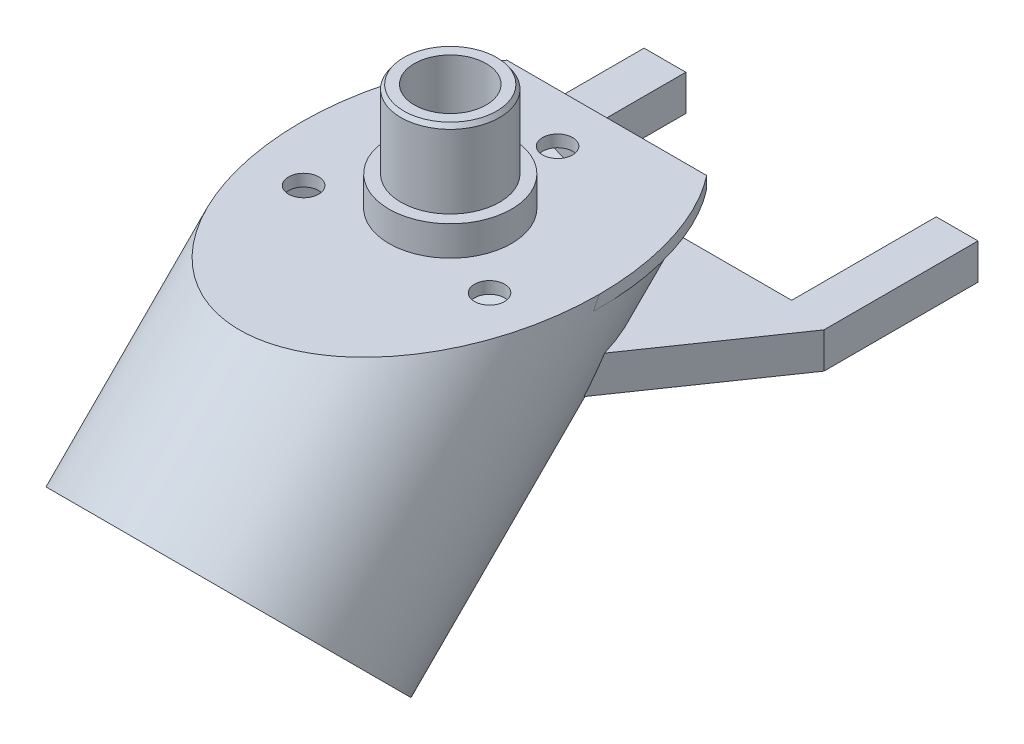
ISO-10303-21;
HEADER;
FILE_DESCRIPTION(('STEP AP214'),'2;1');
FILE_NAME('part.step','',(''),(''),'','','');
FILE_SCHEMA(('AUTOMOTIVE_DESIGN { 1 0 10303 214 1 1 1 1 }'));
ENDSEC;
DATA;
#1=APPLICATION_CONTEXT('core data for automotive mechanical design processes');
#2=APPLICATION_PROTOCOL_DEFINITION('international standard','automotive_design',2000,#1);
#3=PRODUCT_CONTEXT('',#1,'mechanical');
#4=PRODUCT('Part','Part','',(#3));
#5=PRODUCT_RELATED_PRODUCT_CATEGORY('part','',(#4));
#6=PRODUCT_DEFINITION_FORMATION('','',#4);
#7=PRODUCT_DEFINITION_CONTEXT('part definition',#1,'design');
#8=PRODUCT_DEFINITION('design','',#6,#7);
#9=PRODUCT_DEFINITION_SHAPE('','',#8);
#10=(LENGTH_UNIT() NAMED_UNIT(*) SI_UNIT(.MILLI.,.METRE.));
#11=(NAMED_UNIT(*) PLANE_ANGLE_UNIT() SI_UNIT($,.RADIAN.));
#12=(NAMED_UNIT(*) SI_UNIT($,.STERADIAN.) SOLID_ANGLE_UNIT());
#13=UNCERTAINTY_MEASURE_WITH_UNIT(LENGTH_MEASURE(1.E-05),#10,'distance_accuracy_value','');
#14=(GEOMETRIC_REPRESENTATION_CONTEXT(3) GLOBAL_UNCERTAINTY_ASSIGNED_CONTEXT((#13)) GLOBAL_UNIT_ASSIGNED_CONTEXT((#10,
#11,#12)) REPRESENTATION_CONTEXT('',''));
#15=CARTESIAN_POINT('',(0.,0.,0.));
#16=DIRECTION('',(0.,0.,1.));
#17=DIRECTION('',(1.,0.,0.));
#18=AXIS2_PLACEMENT_3D('',#15,#16,#17);
#19=CARTESIAN_POINT('',(0.,-54.8629664321684,54.8629664321686));
#20=DIRECTION('',(0.,0.707106781186546,-0.707106781186549));
#21=DIRECTION('',(0.,0.707106781186549,0.707106781186546));
#22=AXIS2_PLACEMENT_3D('',#19,#20,#21);
#23=CYLINDRICAL_SURFACE('',#22,23.);
#24=CARTESIAN_POINT('',(0.,-2.00000000000001,2.00000000000002));
#25=DIRECTION('',(0.,1.,0.));
#26=DIRECTION('',(0.,0.,-1.));
#27=AXIS2_PLACEMENT_3D('',#24,#25,#26);
#28=ELLIPSE('',#27,32.5269119345813,23.);
#29=CARTESIAN_POINT('',(-13.5815371767009,-2.,-24.2504037271007));
#30=VERTEX_POINT('',#29);
#31=CARTESIAN_POINT('',(13.5815371767009,-2.,-24.2504037271007));
#32=VERTEX_POINT('',#31);
#33=EDGE_CURVE('E157',#30,#32,#28,.T.);
#34=ORIENTED_EDGE('',*,*,#33,.T.);
#35=CARTESIAN_POINT('',(0.,24.2504037271006,-24.2504037271007));
#36=DIRECTION('',(0.,0.,1.));
#37=DIRECTION('',(0.,1.,0.));
#38=AXIS2_PLACEMENT_3D('',#35,#36,#37);
#39=ELLIPSE('',#38,32.5269119345811,23.);
#40=EDGE_CURVE('E58',#32,#30,#39,.F.);
#41=ORIENTED_EDGE('',*,*,#40,.T.);
#42=EDGE_LOOP('',(#34,#41));
#43=FACE_BOUND('',#42,.T.);
#44=CARTESIAN_POINT('',(0.,-37.1852969025047,37.1852969025049));
#45=DIRECTION('',(0.,-0.707106781186546,0.707106781186549));
#46=DIRECTION('',(0.,-0.707106781186549,-0.707106781186546));
#47=AXIS2_PLACEMENT_3D('',#44,#45,#46);
#48=CIRCLE('',#47,23.);
#49=CARTESIAN_POINT('',(0.,-53.4487528697953,20.9218409352143));
#50=VERTEX_POINT('',#49);
#51=EDGE_CURVE('E239',#50,#50,#48,.F.);
#52=ORIENTED_EDGE('',*,*,#51,.F.);
#53=EDGE_LOOP('',(#52));
#54=FACE_BOUND('',#53,.T.);
#55=ADVANCED_FACE('F44',(#43,#54),#23,.F.);
#56=CARTESIAN_POINT('',(0.,-54.8629664321684,54.8629664321686));
#57=DIRECTION('',(0.,0.707106781186546,-0.707106781186549));
#58=DIRECTION('',(0.,0.707106781186549,0.707106781186546));
#59=AXIS2_PLACEMENT_3D('',#56,#57,#58);
#60=CYLINDRICAL_SURFACE('',#59,25.);
#61=CARTESIAN_POINT('',(0.,-11.,11.0000000000001));
#62=DIRECTION('',(0.,1.,0.));
#63=DIRECTION('',(0.,0.,-1.));
#64=AXIS2_PLACEMENT_3D('',#61,#62,#63);
#65=ELLIPSE('',#64,35.3553390593275,25.);
#66=CARTESIAN_POINT('',(-18.,-11.,-13.5356882927706));
#67=VERTEX_POINT('',#66);
#68=CARTESIAN_POINT('',(22.9865996912914,-11.,-2.90080822343224));
#69=VERTEX_POINT('',#68);
#70=EDGE_CURVE('E232',#67,#69,#65,.F.);
#71=ORIENTED_EDGE('',*,*,#70,.F.);
#72=DIRECTION('',(0.,0.707106781186546,-0.707106781186549));
#73=VECTOR('',#72,1.);
#74=CARTESIAN_POINT('',(-18.,-67.1308105785537,42.5951222857834));
#75=LINE('',#74,#73);
#76=CARTESIAN_POINT('',(-18.,-17.,-7.53568829277057));
#77=VERTEX_POINT('',#76);
#78=EDGE_CURVE('E231',#77,#67,#75,.T.);
#79=ORIENTED_EDGE('',*,*,#78,.F.);
#80=CARTESIAN_POINT('',(0.,-17.,17.0000000000001));
#81=DIRECTION('',(0.,1.,0.));
#82=DIRECTION('',(0.,0.,-1.));
#83=AXIS2_PLACEMENT_3D('',#80,#81,#82);
#84=ELLIPSE('',#83,35.3553390593275,25.);
#85=CARTESIAN_POINT('',(21.5769103139741,-17.,-0.857040141228293));
#86=VERTEX_POINT('',#85);
#87=EDGE_CURVE('E161',#77,#86,#84,.F.);
#88=ORIENTED_EDGE('',*,*,#87,.T.);
#89=CARTESIAN_POINT('',(0.,-30.4251709059995,30.4251709059997));
#90=DIRECTION('',(-0.823176237286633,0.,-0.567785947665685));
#91=DIRECTION('',(0.360853383397402,0.772064025213345,-0.523165343521545));
#92=AXIS2_PLACEMENT_3D('',#89,#90,#91);
#93=ELLIPSE('',#92,62.2687814037706,25.);
#94=EDGE_CURVE('E170',#86,#69,#93,.F.);
#95=ORIENTED_EDGE('',*,*,#94,.T.);
#96=EDGE_LOOP('',(#71,#79,#88,#95));
#97=FACE_BOUND('',#96,.T.);
#98=CARTESIAN_POINT('',(0.,26.2504037271006,-26.2504037271007));
#99=DIRECTION('',(0.,0.,1.));
#100=DIRECTION('',(0.,1.,0.));
#101=AXIS2_PLACEMENT_3D('',#98,#99,#100);
#102=ELLIPSE('',#101,35.3553390593273,25.);
#103=CARTESIAN_POINT('',(15.0318776148526,-2.00000000000001,-26.2504037271007));
#104=VERTEX_POINT('',#103);
#105=CARTESIAN_POINT('',(-15.0318776148526,-2.00000000000001,-26.2504037271007));
#106=VERTEX_POINT('',#105);
#107=EDGE_CURVE('E154',#104,#106,#102,.F.);
#108=ORIENTED_EDGE('',*,*,#107,.F.);
#109=CARTESIAN_POINT('',(0.,-2.00000000000001,2.00000000000002));
#110=DIRECTION('',(0.,1.,0.));
#111=DIRECTION('',(0.,0.,-1.));
#112=AXIS2_PLACEMENT_3D('',#109,#110,#111);
#113=ELLIPSE('',#112,35.3553390593275,25.);
#114=CARTESIAN_POINT('',(24.9899979991996,-2.,0.999999999963205));
#115=VERTEX_POINT('',#114);
#116=EDGE_CURVE('E176',#115,#104,#113,.T.);
#117=ORIENTED_EDGE('',*,*,#116,.F.);
#118=CARTESIAN_POINT('',(24.9899979991996,-2.,1.00000000000001));
#119=CARTESIAN_POINT('',(24.9964963801354,-1.35030025188276,0.675150125988896));
#120=CARTESIAN_POINT('',(24.9998282230233,-0.700593847209135,0.350296923653296));
#121=CARTESIAN_POINT('',(24.9999978430183,-0.0339205285220589,0.0169602642635038));
#122=CARTESIAN_POINT('',(25.0000000003973,-0.0169602665290214,0.00848013326577682));
#123=CARTESIAN_POINT('',(25.,0.,0.));
#124=B_SPLINE_CURVE_WITH_KNOTS('',3,(#118,#119,#120,#121,#122,#123),.UNSPECIFIED.,.F.,.F.,(4,2,
4),(0.,2.17920445315897,2.23609090162773),.UNSPECIFIED.);
#125=CARTESIAN_POINT('',(25.,0.,0.));
#126=VERTEX_POINT('',#125);
#127=EDGE_CURVE('E186',#115,#126,#124,.T.);
#128=ORIENTED_EDGE('',*,*,#127,.T.);
#129=CARTESIAN_POINT('',(0.,0.,0.));
#130=DIRECTION('',(0.,1.,0.));
#131=DIRECTION('',(0.,0.,1.));
#132=AXIS2_PLACEMENT_3D('',#129,#130,#131);
#133=ELLIPSE('',#132,35.3553390593275,25.);
#134=CARTESIAN_POINT('',(-25.,0.,0.));
#135=VERTEX_POINT('',#134);
#136=EDGE_CURVE('E217',#135,#126,#133,.T.);
#137=ORIENTED_EDGE('',*,*,#136,.F.);
#138=CARTESIAN_POINT('',(-24.9899979991996,-2.,0.999999999999999));
#139=CARTESIAN_POINT('',(-24.9964963801355,-1.35030025191845,0.675150125917529));
#140=CARTESIAN_POINT('',(-24.9998282230233,-0.700593847245729,0.350296923580118));
#141=CARTESIAN_POINT('',(-24.9999978430183,-0.0339205285239066,0.0169602642598314));
#142=CARTESIAN_POINT('',(-25.0000000003973,-0.0169602665299625,0.00848013326392048));
#143=CARTESIAN_POINT('',(-25.,0.,0.));
#144=B_SPLINE_CURVE_WITH_KNOTS('',3,(#138,#139,#140,#141,#142,#143),.UNSPECIFIED.,.F.,.F.,(4,2,
4),(0.,2.17920445315896,2.23609090162771),.UNSPECIFIED.);
#145=CARTESIAN_POINT('',(-24.9899979991996,-2.,0.999999999963205));
#146=VERTEX_POINT('',#145);
#147=EDGE_CURVE('E177',#135,#146,#144,.F.);
#148=ORIENTED_EDGE('',*,*,#147,.T.);
#149=EDGE_CURVE('E179',#106,#146,#113,.T.);
#150=ORIENTED_EDGE('',*,*,#149,.F.);
#151=EDGE_LOOP('',(#108,#117,#128,#137,#148,#150));
#152=FACE_BOUND('',#151,.T.);
#153=CARTESIAN_POINT('',(0.,-37.1852969025047,37.1852969025049));
#154=DIRECTION('',(0.,-0.707106781186546,0.707106781186549));
#155=DIRECTION('',(0.,-0.707106781186549,-0.707106781186546));
#156=AXIS2_PLACEMENT_3D('',#153,#154,#155);
#157=CIRCLE('',#156,25.);
#158=CARTESIAN_POINT('',(0.,-54.8629664321685,19.5076273728412));
#159=VERTEX_POINT('',#158);
#160=EDGE_CURVE('E238',#159,#159,#157,.F.);
#161=ORIENTED_EDGE('',*,*,#160,.T.);
#162=EDGE_LOOP('',(#161));
#163=FACE_BOUND('',#162,.T.);
#164=ADVANCED_FACE('F194',(#97,#152,#163),#60,.T.);
#165=CARTESIAN_POINT('',(0.,-2.,0.));
#166=DIRECTION('',(0.,1.,0.));
#167=DIRECTION('',(0.,0.,1.));
#168=AXIS2_PLACEMENT_3D('',#165,#166,#167);
#169=ELLIPSE('',#168,35.3553390593275,25.);
#170=DIRECTION('',(0.,1.,0.));
#171=VECTOR('',#170,1.);
#172=SURFACE_OF_LINEAR_EXTRUSION('',#169,#171);
#173=DIRECTION('',(0.,1.,0.));
#174=VECTOR('',#173,1.);
#175=CARTESIAN_POINT('',(16.7468848471025,-2.,-26.2504037271007));
#176=LINE('',#175,#174);
#177=CARTESIAN_POINT('',(16.7468848471025,0.,-26.2504037271007));
#178=VERTEX_POINT('',#177);
#179=CARTESIAN_POINT('',(16.7468848471025,-2.,-26.2504037271007));
#180=VERTEX_POINT('',#179);
#181=EDGE_CURVE('E350',#178,#180,#176,.F.);
#182=ORIENTED_EDGE('',*,*,#181,.F.);
#183=EDGE_CURVE('E225',#126,#178,#133,.T.);
#184=ORIENTED_EDGE('',*,*,#183,.F.);
#185=ORIENTED_EDGE('',*,*,#127,.F.);
#186=EDGE_CURVE('E215',#115,#180,#169,.T.);
#187=ORIENTED_EDGE('',*,*,#186,.T.);
#188=EDGE_LOOP('',(#182,#184,#185,#187));
#189=FACE_BOUND('',#188,.T.);
#190=ADVANCED_FACE('F206',(#189),#172,.T.);
#191=CARTESIAN_POINT('',(0.,-2.,0.));
#192=DIRECTION('',(0.,1.,0.));
#193=DIRECTION('',(0.,0.,1.));
#194=AXIS2_PLACEMENT_3D('',#191,#192,#193);
#195=PLANE('',#194);
#196=CARTESIAN_POINT('',(-16.7468848471025,-2.,-26.2504037271007));
#197=VERTEX_POINT('',#196);
#198=EDGE_CURVE('E220',#197,#146,#169,.T.);
#199=ORIENTED_EDGE('',*,*,#198,.F.);
#200=DIRECTION('',(1.,0.,0.));
#201=VECTOR('',#200,1.);
#202=CARTESIAN_POINT('',(0.,-2.,-26.2504037271007));
#203=LINE('',#202,#201);
#204=EDGE_CURVE('E342',#197,#106,#203,.T.);
#205=ORIENTED_EDGE('',*,*,#204,.T.);
#206=ORIENTED_EDGE('',*,*,#149,.T.);
#207=EDGE_LOOP('',(#199,#205,#206));
#208=FACE_BOUND('',#207,.T.);
#209=ADVANCED_FACE('F412',(#208),#195,.F.);
#210=CARTESIAN_POINT('',(15.5884572681206,-2.,8.99999999999962));
#211=DIRECTION('',(0.,1.,0.));
#212=DIRECTION('',(0.,0.,1.));
#213=AXIS2_PLACEMENT_3D('',#210,#211,#212);
#214=CIRCLE('',#213,2.525);
#215=CARTESIAN_POINT('',(15.5884572681206,-2.,11.5249999999996));
#216=VERTEX_POINT('',#215);
#217=EDGE_CURVE('E159',#216,#216,#214,.F.);
#218=ORIENTED_EDGE('',*,*,#217,.F.);
#219=EDGE_LOOP('',(#218));
#220=FACE_BOUND('',#219,.T.);
#221=CARTESIAN_POINT('',(-15.5884572681192,-2.,9.00000000000039));
#222=DIRECTION('',(0.,1.,0.));
#223=DIRECTION('',(0.,0.,1.));
#224=AXIS2_PLACEMENT_3D('',#221,#222,#223);
#225=CIRCLE('',#224,2.525);
#226=CARTESIAN_POINT('',(-15.5884572681192,-2.,11.5250000000004));
#227=VERTEX_POINT('',#226);
#228=EDGE_CURVE('E332',#227,#227,#225,.F.);
#229=ORIENTED_EDGE('',*,*,#228,.F.);
#230=EDGE_LOOP('',(#229));
#231=FACE_BOUND('',#230,.T.);
#232=CARTESIAN_POINT('',(0.,-2.,-18.));
#233=DIRECTION('',(0.,1.,0.));
#234=DIRECTION('',(0.,0.,1.));
#235=AXIS2_PLACEMENT_3D('',#232,#233,#234);
#236=CIRCLE('',#235,2.525);
#237=CARTESIAN_POINT('',(0.,-2.,-15.475));
#238=VERTEX_POINT('',#237);
#239=EDGE_CURVE('E338',#238,#238,#236,.F.);
#240=ORIENTED_EDGE('',*,*,#239,.F.);
#241=EDGE_LOOP('',(#240));
#242=FACE_BOUND('',#241,.T.);
#243=CARTESIAN_POINT('',(0.,-2.,0.));
#244=DIRECTION('',(0.,1.,0.));
#245=DIRECTION('',(0.,0.,1.));
#246=AXIS2_PLACEMENT_3D('',#243,#244,#245);
#247=CIRCLE('',#246,6.025);
#248=CARTESIAN_POINT('',(0.,-2.,6.025));
#249=VERTEX_POINT('',#248);
#250=EDGE_CURVE('E218',#249,#249,#247,.T.);
#251=ORIENTED_EDGE('',*,*,#250,.T.);
#252=EDGE_LOOP('',(#251));
#253=FACE_BOUND('',#252,.T.);
#254=ORIENTED_EDGE('',*,*,#33,.F.);
#255=DIRECTION('',(1.,0.,0.));
#256=VECTOR('',#255,1.);
#257=CARTESIAN_POINT('',(0.,-2.,-24.2504037271007));
#258=LINE('',#257,#256);
#259=EDGE_CURVE('E149',#30,#32,#258,.T.);
#260=ORIENTED_EDGE('',*,*,#259,.T.);
#261=EDGE_LOOP('',(#254,#260));
#262=FACE_BOUND('',#261,.T.);
#263=ADVANCED_FACE('F162',(#220,#231,#242,#253,#262),#195,.F.);
#264=CARTESIAN_POINT('',(0.,5.,0.));
#265=DIRECTION('',(0.,-1.,0.));
#266=DIRECTION('',(0.,0.,-1.));
#267=AXIS2_PLACEMENT_3D('',#264,#265,#266);
#268=CYLINDRICAL_SURFACE('',#267,10.275);
#269=CARTESIAN_POINT('',(0.,5.,0.));
#270=DIRECTION('',(0.,1.,0.));
#271=DIRECTION('',(0.,0.,1.));
#272=AXIS2_PLACEMENT_3D('',#269,#270,#271);
#273=CIRCLE('',#272,10.275);
#274=CARTESIAN_POINT('',(0.,5.,10.275));
#275=VERTEX_POINT('',#274);
#276=EDGE_CURVE('E165',#275,#275,#273,.T.);
#277=ORIENTED_EDGE('',*,*,#276,.F.);
#278=EDGE_LOOP('',(#277));
#279=FACE_BOUND('',#278,.T.);
#280=CARTESIAN_POINT('',(0.,0.,0.));
#281=DIRECTION('',(0.,1.,0.));
#282=DIRECTION('',(0.,0.,1.));
#283=AXIS2_PLACEMENT_3D('',#280,#281,#282);
#284=CIRCLE('',#283,10.275);
#285=CARTESIAN_POINT('',(0.,0.,10.275));
#286=VERTEX_POINT('',#285);
#287=EDGE_CURVE('E216',#286,#286,#284,.T.);
#288=ORIENTED_EDGE('',*,*,#287,.T.);
#289=EDGE_LOOP('',(#288));
#290=FACE_BOUND('',#289,.T.);
#291=ADVANCED_FACE('F441',(#279,#290),#268,.T.);
#292=CARTESIAN_POINT('',(0.,5.,0.));
#293=DIRECTION('',(0.,1.,0.));
#294=DIRECTION('',(0.,0.,1.));
#295=AXIS2_PLACEMENT_3D('',#292,#293,#294);
#296=PLANE('',#295);
#297=CARTESIAN_POINT('',(0.,5.,0.));
#298=DIRECTION('',(0.,1.,0.));
#299=DIRECTION('',(0.,0.,1.));
#300=AXIS2_PLACEMENT_3D('',#297,#298,#299);
#301=CIRCLE('',#300,8.275);
#302=CARTESIAN_POINT('',(0.,5.,8.275));
#303=VERTEX_POINT('',#302);
#304=EDGE_CURVE('E167',#303,#303,#301,.T.);
#305=ORIENTED_EDGE('',*,*,#304,.F.);
#306=EDGE_LOOP('',(#305));
#307=FACE_BOUND('',#306,.T.);
#308=ORIENTED_EDGE('',*,*,#276,.T.);
#309=EDGE_LOOP('',(#308));
#310=FACE_BOUND('',#309,.T.);
#311=ADVANCED_FACE('F444',(#307,#310),#296,.T.);
#312=CARTESIAN_POINT('',(0.,18.,0.));
#313=DIRECTION('',(0.,-1.,0.));
#314=DIRECTION('',(0.,0.,-1.));
#315=AXIS2_PLACEMENT_3D('',#312,#313,#314);
#316=CYLINDRICAL_SURFACE('',#315,6.025);
#317=CARTESIAN_POINT('',(0.,18.,0.));
#318=DIRECTION('',(0.,1.,0.));
#319=DIRECTION('',(0.,0.,1.));
#320=AXIS2_PLACEMENT_3D('',#317,#318,#319);
#321=CIRCLE('',#320,6.025);
#322=CARTESIAN_POINT('',(0.,18.,6.025));
#323=VERTEX_POINT('',#322);
#324=EDGE_CURVE('E222',#323,#323,#321,.T.);
#325=ORIENTED_EDGE('',*,*,#324,.T.);
#326=EDGE_LOOP('',(#325));
#327=FACE_BOUND('',#326,.T.);
#328=ORIENTED_EDGE('',*,*,#250,.F.);
#329=EDGE_LOOP('',(#328));
#330=FACE_BOUND('',#329,.T.);
#331=ADVANCED_FACE('F456',(#327,#330),#316,.F.);
#332=CARTESIAN_POINT('',(0.,18.,0.));
#333=DIRECTION('',(0.,-1.,0.));
#334=DIRECTION('',(0.,0.,-1.));
#335=AXIS2_PLACEMENT_3D('',#332,#333,#334);
#336=CYLINDRICAL_SURFACE('',#335,8.275);
#337=CARTESIAN_POINT('',(0.,17.3,0.));
#338=DIRECTION('',(0.,1.,0.));
#339=DIRECTION('',(0.,0.,1.));
#340=AXIS2_PLACEMENT_3D('',#337,#338,#339);
#341=CIRCLE('',#340,8.275);
#342=CARTESIAN_POINT('',(0.,17.3,8.275));
#343=VERTEX_POINT('',#342);
#344=EDGE_CURVE('E11',#343,#343,#341,.F.);
#345=ORIENTED_EDGE('',*,*,#344,.T.);
#346=EDGE_LOOP('',(#345));
#347=FACE_BOUND('',#346,.T.);
#348=ORIENTED_EDGE('',*,*,#304,.T.);
#349=EDGE_LOOP('',(#348));
#350=FACE_BOUND('',#349,.T.);
#351=ADVANCED_FACE('F461',(#347,#350),#336,.T.);
#352=CARTESIAN_POINT('',(0.,18.,0.));
#353=DIRECTION('',(0.,1.,0.));
#354=DIRECTION('',(0.,0.,1.));
#355=AXIS2_PLACEMENT_3D('',#352,#353,#354);
#356=PLANE('',#355);
#357=CARTESIAN_POINT('',(0.,18.,0.));
#358=DIRECTION('',(0.,1.,0.));
#359=DIRECTION('',(0.,0.,1.));
#360=AXIS2_PLACEMENT_3D('',#357,#358,#359);
#361=CIRCLE('',#360,7.78485472325321);
#362=CARTESIAN_POINT('',(0.,18.,7.78485472325321));
#363=VERTEX_POINT('',#362);
#364=EDGE_CURVE('E53',#363,#363,#361,.T.);
#365=ORIENTED_EDGE('',*,*,#364,.T.);
#366=EDGE_LOOP('',(#365));
#367=FACE_BOUND('',#366,.T.);
#368=ORIENTED_EDGE('',*,*,#324,.F.);
#369=EDGE_LOOP('',(#368));
#370=FACE_BOUND('',#369,.T.);
#371=ADVANCED_FACE('F207',(#367,#370),#356,.T.);
#372=DIRECTION('',(0.,1.,0.));
#373=VECTOR('',#372,1.);
#374=CARTESIAN_POINT('',(-16.7468848471025,-2.,-26.2504037271007));
#375=LINE('',#374,#373);
#376=CARTESIAN_POINT('',(-16.7468848471025,0.,-26.2504037271007));
#377=VERTEX_POINT('',#376);
#378=EDGE_CURVE('E344',#197,#377,#375,.T.);
#379=ORIENTED_EDGE('',*,*,#378,.F.);
#380=ORIENTED_EDGE('',*,*,#198,.T.);
#381=ORIENTED_EDGE('',*,*,#147,.F.);
#382=EDGE_CURVE('E221',#377,#135,#133,.T.);
#383=ORIENTED_EDGE('',*,*,#382,.F.);
#384=EDGE_LOOP('',(#379,#380,#381,#383));
#385=FACE_BOUND('',#384,.T.);
#386=ADVANCED_FACE('F197',(#385),#172,.T.);
#387=ORIENTED_EDGE('',*,*,#116,.T.);
#388=EDGE_CURVE('E68',#104,#180,#203,.T.);
#389=ORIENTED_EDGE('',*,*,#388,.T.);
#390=ORIENTED_EDGE('',*,*,#186,.F.);
#391=EDGE_LOOP('',(#387,#389,#390));
#392=FACE_BOUND('',#391,.T.);
#393=ADVANCED_FACE('F204',(#392),#195,.F.);
#394=CARTESIAN_POINT('',(0.,0.,0.));
#395=DIRECTION('',(0.,1.,0.));
#396=DIRECTION('',(0.,0.,1.));
#397=AXIS2_PLACEMENT_3D('',#394,#395,#396);
#398=PLANE('',#397);
#399=CARTESIAN_POINT('',(15.5884572681206,0.,8.99999999999962));
#400=DIRECTION('',(0.,1.,0.));
#401=DIRECTION('',(0.,0.,1.));
#402=AXIS2_PLACEMENT_3D('',#399,#400,#401);
#403=CIRCLE('',#402,2.525);
#404=CARTESIAN_POINT('',(15.5884572681206,0.,11.5249999999996));
#405=VERTEX_POINT('',#404);
#406=EDGE_CURVE('E321',#405,#405,#403,.T.);
#407=ORIENTED_EDGE('',*,*,#406,.F.);
#408=EDGE_LOOP('',(#407));
#409=FACE_BOUND('',#408,.T.);
#410=CARTESIAN_POINT('',(-15.5884572681192,0.,9.00000000000039));
#411=DIRECTION('',(0.,1.,0.));
#412=DIRECTION('',(0.,0.,1.));
#413=AXIS2_PLACEMENT_3D('',#410,#411,#412);
#414=CIRCLE('',#413,2.525);
#415=CARTESIAN_POINT('',(-15.5884572681192,0.,11.5250000000004));
#416=VERTEX_POINT('',#415);
#417=EDGE_CURVE('E328',#416,#416,#414,.T.);
#418=ORIENTED_EDGE('',*,*,#417,.F.);
#419=EDGE_LOOP('',(#418));
#420=FACE_BOUND('',#419,.T.);
#421=CARTESIAN_POINT('',(0.,0.,-18.));
#422=DIRECTION('',(0.,1.,0.));
#423=DIRECTION('',(0.,0.,1.));
#424=AXIS2_PLACEMENT_3D('',#421,#422,#423);
#425=CIRCLE('',#424,2.525);
#426=CARTESIAN_POINT('',(0.,0.,-15.475));
#427=VERTEX_POINT('',#426);
#428=EDGE_CURVE('E340',#427,#427,#425,.T.);
#429=ORIENTED_EDGE('',*,*,#428,.F.);
#430=EDGE_LOOP('',(#429));
#431=FACE_BOUND('',#430,.T.);
#432=DIRECTION('',(1.,0.,0.));
#433=VECTOR('',#432,1.);
#434=CARTESIAN_POINT('',(0.,0.,-26.2504037271007));
#435=LINE('',#434,#433);
#436=EDGE_CURVE('E347',#377,#178,#435,.T.);
#437=ORIENTED_EDGE('',*,*,#436,.F.);
#438=ORIENTED_EDGE('',*,*,#382,.T.);
#439=ORIENTED_EDGE('',*,*,#136,.T.);
#440=ORIENTED_EDGE('',*,*,#183,.T.);
#441=EDGE_LOOP('',(#437,#438,#439,#440));
#442=FACE_BOUND('',#441,.T.);
#443=ORIENTED_EDGE('',*,*,#287,.F.);
#444=EDGE_LOOP('',(#443));
#445=FACE_BOUND('',#444,.T.);
#446=ADVANCED_FACE('F209',(#409,#420,#431,#442,#445),#398,.T.);
#447=CARTESIAN_POINT('',(0.,-17.,0.));
#448=DIRECTION('',(0.,1.,0.));
#449=DIRECTION('',(0.,0.,1.));
#450=AXIS2_PLACEMENT_3D('',#447,#448,#449);
#451=PLANE('',#450);
#452=ORIENTED_EDGE('',*,*,#87,.F.);
#453=DIRECTION('',(0.,0.,-1.));
#454=VECTOR('',#453,1.);
#455=CARTESIAN_POINT('',(-18.,-17.,0.));
#456=LINE('',#455,#454);
#457=CARTESIAN_POINT('',(-18.,-17.,-50.5));
#458=VERTEX_POINT('',#457);
#459=EDGE_CURVE('E361',#77,#458,#456,.T.);
#460=ORIENTED_EDGE('',*,*,#459,.T.);
#461=DIRECTION('',(1.,0.,0.));
#462=VECTOR('',#461,1.);
#463=CARTESIAN_POINT('',(0.,-17.,-50.5));
#464=LINE('',#463,#462);
#465=CARTESIAN_POINT('',(-11.,-17.,-50.5));
#466=VERTEX_POINT('',#465);
#467=EDGE_CURVE('E359',#458,#466,#464,.T.);
#468=ORIENTED_EDGE('',*,*,#467,.T.);
#469=DIRECTION('',(0.,0.,-1.));
#470=VECTOR('',#469,1.);
#471=CARTESIAN_POINT('',(-11.,-17.,0.));
#472=LINE('',#471,#470);
#473=CARTESIAN_POINT('',(-11.,-17.,-26.2504037271007));
#474=VERTEX_POINT('',#473);
#475=EDGE_CURVE('E357',#474,#466,#472,.T.);
#476=ORIENTED_EDGE('',*,*,#475,.F.);
#477=DIRECTION('',(-1.,0.,0.));
#478=VECTOR('',#477,1.);
#479=CARTESIAN_POINT('',(0.,-17.,-26.2504037271007));
#480=LINE('',#479,#478);
#481=CARTESIAN_POINT('',(31.,-17.,-26.2504037271007));
#482=VERTEX_POINT('',#481);
#483=EDGE_CURVE('E352',#482,#474,#480,.T.);
#484=ORIENTED_EDGE('',*,*,#483,.F.);
#485=DIRECTION('',(0.,0.,-1.));
#486=VECTOR('',#485,1.);
#487=CARTESIAN_POINT('',(31.,-17.,0.));
#488=LINE('',#487,#486);
#489=CARTESIAN_POINT('',(31.,-17.,-50.5));
#490=VERTEX_POINT('',#489);
#491=EDGE_CURVE('E353',#482,#490,#488,.T.);
#492=ORIENTED_EDGE('',*,*,#491,.T.);
#493=DIRECTION('',(1.,0.,0.));
#494=VECTOR('',#493,1.);
#495=CARTESIAN_POINT('',(0.,-17.,-50.5));
#496=LINE('',#495,#494);
#497=CARTESIAN_POINT('',(38.,-17.,-50.5));
#498=VERTEX_POINT('',#497);
#499=EDGE_CURVE('E369',#490,#498,#496,.T.);
#500=ORIENTED_EDGE('',*,*,#499,.T.);
#501=DIRECTION('',(0.,0.,-1.));
#502=VECTOR('',#501,1.);
#503=CARTESIAN_POINT('',(38.,-17.,0.));
#504=LINE('',#503,#502);
#505=CARTESIAN_POINT('',(38.,-17.,-24.6672404956827));
#506=VERTEX_POINT('',#505);
#507=EDGE_CURVE('E370',#506,#498,#504,.T.);
#508=ORIENTED_EDGE('',*,*,#507,.F.);
#509=DIRECTION('',(0.567785947665685,0.,-0.823176237286633));
#510=VECTOR('',#509,1.);
#511=CARTESIAN_POINT('',(14.2203567363993,-17.,9.80849344283141));
#512=LINE('',#511,#510);
#513=EDGE_CURVE('E362',#86,#506,#512,.T.);
#514=ORIENTED_EDGE('',*,*,#513,.F.);
#515=EDGE_LOOP('',(#452,#460,#468,#476,#484,#492,#500,#508,#514));
#516=FACE_BOUND('',#515,.T.);
#517=ADVANCED_FACE('F297',(#516),#451,.F.);
#518=CARTESIAN_POINT('',(0.,-11.,0.));
#519=DIRECTION('',(0.,1.,0.));
#520=DIRECTION('',(0.,0.,1.));
#521=AXIS2_PLACEMENT_3D('',#518,#519,#520);
#522=PLANE('',#521);
#523=DIRECTION('',(0.,0.,-1.));
#524=VECTOR('',#523,1.);
#525=CARTESIAN_POINT('',(-18.,-11.,0.));
#526=LINE('',#525,#524);
#527=CARTESIAN_POINT('',(-18.,-11.,-50.5));
#528=VERTEX_POINT('',#527);
#529=EDGE_CURVE('E384',#67,#528,#526,.T.);
#530=ORIENTED_EDGE('',*,*,#529,.F.);
#531=ORIENTED_EDGE('',*,*,#70,.T.);
#532=DIRECTION('',(0.567785947665685,0.,-0.823176237286633));
#533=VECTOR('',#532,1.);
#534=CARTESIAN_POINT('',(14.2203567363993,-11.,9.80849344283141));
#535=LINE('',#534,#533);
#536=CARTESIAN_POINT('',(38.,-11.,-24.6672404956827));
#537=VERTEX_POINT('',#536);
#538=EDGE_CURVE('E383',#69,#537,#535,.T.);
#539=ORIENTED_EDGE('',*,*,#538,.T.);
#540=DIRECTION('',(0.,0.,-1.));
#541=VECTOR('',#540,1.);
#542=CARTESIAN_POINT('',(38.,-11.,0.));
#543=LINE('',#542,#541);
#544=CARTESIAN_POINT('',(38.,-11.,-50.5));
#545=VERTEX_POINT('',#544);
#546=EDGE_CURVE('E390',#537,#545,#543,.T.);
#547=ORIENTED_EDGE('',*,*,#546,.T.);
#548=DIRECTION('',(1.,0.,0.));
#549=VECTOR('',#548,1.);
#550=CARTESIAN_POINT('',(0.,-11.,-50.5));
#551=LINE('',#550,#549);
#552=CARTESIAN_POINT('',(31.,-11.,-50.5));
#553=VERTEX_POINT('',#552);
#554=EDGE_CURVE('E387',#553,#545,#551,.T.);
#555=ORIENTED_EDGE('',*,*,#554,.F.);
#556=DIRECTION('',(0.,0.,-1.));
#557=VECTOR('',#556,1.);
#558=CARTESIAN_POINT('',(31.,-11.,0.));
#559=LINE('',#558,#557);
#560=CARTESIAN_POINT('',(31.,-11.,-26.2504037271007));
#561=VERTEX_POINT('',#560);
#562=EDGE_CURVE('E373',#561,#553,#559,.T.);
#563=ORIENTED_EDGE('',*,*,#562,.F.);
#564=DIRECTION('',(-1.,0.,0.));
#565=VECTOR('',#564,1.);
#566=CARTESIAN_POINT('',(0.,-11.,-26.2504037271007));
#567=LINE('',#566,#565);
#568=CARTESIAN_POINT('',(-11.,-11.,-26.2504037271007));
#569=VERTEX_POINT('',#568);
#570=EDGE_CURVE('E376',#561,#569,#567,.T.);
#571=ORIENTED_EDGE('',*,*,#570,.T.);
#572=DIRECTION('',(0.,0.,-1.));
#573=VECTOR('',#572,1.);
#574=CARTESIAN_POINT('',(-11.,-11.,0.));
#575=LINE('',#574,#573);
#576=CARTESIAN_POINT('',(-11.,-11.,-50.5));
#577=VERTEX_POINT('',#576);
#578=EDGE_CURVE('E377',#569,#577,#575,.T.);
#579=ORIENTED_EDGE('',*,*,#578,.T.);
#580=DIRECTION('',(1.,0.,0.));
#581=VECTOR('',#580,1.);
#582=CARTESIAN_POINT('',(0.,-11.,-50.5));
#583=LINE('',#582,#581);
#584=EDGE_CURVE('E379',#528,#577,#583,.T.);
#585=ORIENTED_EDGE('',*,*,#584,.F.);
#586=EDGE_LOOP('',(#530,#531,#539,#547,#555,#563,#571,#579,#585));
#587=FACE_BOUND('',#586,.T.);
#588=ADVANCED_FACE('F298',(#587),#522,.T.);
#589=CARTESIAN_POINT('',(0.,-11.,-50.5));
#590=DIRECTION('',(0.,0.,-1.));
#591=DIRECTION('',(-1.,0.,0.));
#592=AXIS2_PLACEMENT_3D('',#589,#590,#591);
#593=PLANE('',#592);
#594=DIRECTION('',(0.,-1.,0.));
#595=VECTOR('',#594,1.);
#596=CARTESIAN_POINT('',(38.,-11.,-50.5));
#597=LINE('',#596,#595);
#598=EDGE_CURVE('E392',#545,#498,#597,.T.);
#599=ORIENTED_EDGE('',*,*,#598,.T.);
#600=ORIENTED_EDGE('',*,*,#499,.F.);
#601=DIRECTION('',(0.,-1.,0.));
#602=VECTOR('',#601,1.);
#603=CARTESIAN_POINT('',(31.,-11.,-50.5));
#604=LINE('',#603,#602);
#605=EDGE_CURVE('E395',#553,#490,#604,.T.);
#606=ORIENTED_EDGE('',*,*,#605,.F.);
#607=ORIENTED_EDGE('',*,*,#554,.T.);
#608=EDGE_LOOP('',(#599,#600,#606,#607));
#609=FACE_BOUND('',#608,.T.);
#610=ADVANCED_FACE('F292',(#609),#593,.T.);
#611=CARTESIAN_POINT('',(38.,-11.,0.));
#612=DIRECTION('',(-1.,0.,0.));
#613=DIRECTION('',(0.,0.,1.));
#614=AXIS2_PLACEMENT_3D('',#611,#612,#613);
#615=PLANE('',#614);
#616=DIRECTION('',(0.,-1.,0.));
#617=VECTOR('',#616,1.);
#618=CARTESIAN_POINT('',(38.,-11.,-24.6672404956827));
#619=LINE('',#618,#617);
#620=EDGE_CURVE('E398',#537,#506,#619,.T.);
#621=ORIENTED_EDGE('',*,*,#620,.T.);
#622=ORIENTED_EDGE('',*,*,#507,.T.);
#623=ORIENTED_EDGE('',*,*,#598,.F.);
#624=ORIENTED_EDGE('',*,*,#546,.F.);
#625=EDGE_LOOP('',(#621,#622,#623,#624));
#626=FACE_BOUND('',#625,.T.);
#627=ADVANCED_FACE('F286',(#626),#615,.F.);
#628=CARTESIAN_POINT('',(14.2203567363993,-11.,9.80849344283141));
#629=DIRECTION('',(-0.823176237286633,0.,-0.567785947665685));
#630=DIRECTION('',(-0.567785947665685,0.,0.823176237286633));
#631=AXIS2_PLACEMENT_3D('',#628,#629,#630);
#632=PLANE('',#631);
#633=ORIENTED_EDGE('',*,*,#94,.F.);
#634=ORIENTED_EDGE('',*,*,#513,.T.);
#635=ORIENTED_EDGE('',*,*,#620,.F.);
#636=ORIENTED_EDGE('',*,*,#538,.F.);
#637=EDGE_LOOP('',(#633,#634,#635,#636));
#638=FACE_BOUND('',#637,.T.);
#639=ADVANCED_FACE('F282',(#638),#632,.F.);
#640=CARTESIAN_POINT('',(-18.,-11.,0.));
#641=DIRECTION('',(-1.,0.,0.));
#642=DIRECTION('',(0.,0.,1.));
#643=AXIS2_PLACEMENT_3D('',#640,#641,#642);
#644=PLANE('',#643);
#645=ORIENTED_EDGE('',*,*,#459,.F.);
#646=ORIENTED_EDGE('',*,*,#78,.T.);
#647=ORIENTED_EDGE('',*,*,#529,.T.);
#648=DIRECTION('',(0.,-1.,0.));
#649=VECTOR('',#648,1.);
#650=CARTESIAN_POINT('',(-18.,-11.,-50.5));
#651=LINE('',#650,#649);
#652=EDGE_CURVE('E397',#528,#458,#651,.T.);
#653=ORIENTED_EDGE('',*,*,#652,.T.);
#654=EDGE_LOOP('',(#645,#646,#647,#653));
#655=FACE_BOUND('',#654,.T.);
#656=ADVANCED_FACE('F279',(#655),#644,.T.);
#657=CARTESIAN_POINT('',(0.,-11.,-50.5));
#658=DIRECTION('',(0.,0.,-1.));
#659=DIRECTION('',(-1.,0.,0.));
#660=AXIS2_PLACEMENT_3D('',#657,#658,#659);
#661=PLANE('',#660);
#662=DIRECTION('',(0.,-1.,0.));
#663=VECTOR('',#662,1.);
#664=CARTESIAN_POINT('',(-11.,-11.,-50.5));
#665=LINE('',#664,#663);
#666=EDGE_CURVE('E405',#577,#466,#665,.T.);
#667=ORIENTED_EDGE('',*,*,#666,.T.);
#668=ORIENTED_EDGE('',*,*,#467,.F.);
#669=ORIENTED_EDGE('',*,*,#652,.F.);
#670=ORIENTED_EDGE('',*,*,#584,.T.);
#671=EDGE_LOOP('',(#667,#668,#669,#670));
#672=FACE_BOUND('',#671,.T.);
#673=ADVANCED_FACE('F278',(#672),#661,.T.);
#674=CARTESIAN_POINT('',(-11.,-11.,0.));
#675=DIRECTION('',(-1.,0.,0.));
#676=DIRECTION('',(0.,0.,1.));
#677=AXIS2_PLACEMENT_3D('',#674,#675,#676);
#678=PLANE('',#677);
#679=DIRECTION('',(0.,-1.,0.));
#680=VECTOR('',#679,1.);
#681=CARTESIAN_POINT('',(-11.,-11.,-26.2504037271007));
#682=LINE('',#681,#680);
#683=EDGE_CURVE('E401',#569,#474,#682,.T.);
#684=ORIENTED_EDGE('',*,*,#683,.T.);
#685=ORIENTED_EDGE('',*,*,#475,.T.);
#686=ORIENTED_EDGE('',*,*,#666,.F.);
#687=ORIENTED_EDGE('',*,*,#578,.F.);
#688=EDGE_LOOP('',(#684,#685,#686,#687));
#689=FACE_BOUND('',#688,.T.);
#690=ADVANCED_FACE('F275',(#689),#678,.F.);
#691=CARTESIAN_POINT('',(0.,-11.,-26.2504037271007));
#692=DIRECTION('',(0.,0.,1.));
#693=DIRECTION('',(1.,0.,0.));
#694=AXIS2_PLACEMENT_3D('',#691,#692,#693);
#695=PLANE('',#694);
#696=DIRECTION('',(0.,-1.,0.));
#697=VECTOR('',#696,1.);
#698=CARTESIAN_POINT('',(31.,-11.,-26.2504037271007));
#699=LINE('',#698,#697);
#700=EDGE_CURVE('E172',#561,#482,#699,.T.);
#701=ORIENTED_EDGE('',*,*,#700,.T.);
#702=ORIENTED_EDGE('',*,*,#483,.T.);
#703=ORIENTED_EDGE('',*,*,#683,.F.);
#704=ORIENTED_EDGE('',*,*,#570,.F.);
#705=EDGE_LOOP('',(#701,#702,#703,#704));
#706=FACE_BOUND('',#705,.T.);
#707=ADVANCED_FACE('F266',(#706),#695,.F.);
#708=CARTESIAN_POINT('',(31.,-11.,0.));
#709=DIRECTION('',(-1.,0.,0.));
#710=DIRECTION('',(0.,0.,1.));
#711=AXIS2_PLACEMENT_3D('',#708,#709,#710);
#712=PLANE('',#711);
#713=ORIENTED_EDGE('',*,*,#605,.T.);
#714=ORIENTED_EDGE('',*,*,#491,.F.);
#715=ORIENTED_EDGE('',*,*,#700,.F.);
#716=ORIENTED_EDGE('',*,*,#562,.T.);
#717=EDGE_LOOP('',(#713,#714,#715,#716));
#718=FACE_BOUND('',#717,.T.);
#719=ADVANCED_FACE('F262',(#718),#712,.T.);
#720=CARTESIAN_POINT('',(0.,0.,-26.2504037271007));
#721=DIRECTION('',(0.,0.,1.));
#722=DIRECTION('',(1.,0.,0.));
#723=AXIS2_PLACEMENT_3D('',#720,#721,#722);
#724=PLANE('',#723);
#725=ORIENTED_EDGE('',*,*,#107,.T.);
#726=ORIENTED_EDGE('',*,*,#204,.F.);
#727=ORIENTED_EDGE('',*,*,#378,.T.);
#728=ORIENTED_EDGE('',*,*,#436,.T.);
#729=ORIENTED_EDGE('',*,*,#181,.T.);
#730=ORIENTED_EDGE('',*,*,#388,.F.);
#731=EDGE_LOOP('',(#725,#726,#727,#728,#729,#730));
#732=FACE_BOUND('',#731,.T.);
#733=ADVANCED_FACE('F270',(#732),#724,.F.);
#734=CARTESIAN_POINT('',(-0.0065144386564587,-8.53476814728231,-24.2504037271007));
#735=DIRECTION('',(0.,0.,1.));
#736=DIRECTION('',(1.,0.,0.));
#737=AXIS2_PLACEMENT_3D('',#734,#735,#736);
#738=PLANE('',#737);
#739=ORIENTED_EDGE('',*,*,#40,.F.);
#740=ORIENTED_EDGE('',*,*,#259,.F.);
#741=EDGE_LOOP('',(#739,#740));
#742=FACE_BOUND('',#741,.T.);
#743=ADVANCED_FACE('F151',(#742),#738,.T.);
#744=CARTESIAN_POINT('',(0.,-72.5416359618321,-18.));
#745=DIRECTION('',(0.,1.,0.));
#746=DIRECTION('',(0.,0.,1.));
#747=AXIS2_PLACEMENT_3D('',#744,#745,#746);
#748=CYLINDRICAL_SURFACE('',#747,2.525);
#749=ORIENTED_EDGE('',*,*,#428,.T.);
#750=EDGE_LOOP('',(#749));
#751=FACE_BOUND('',#750,.T.);
#752=ORIENTED_EDGE('',*,*,#239,.T.);
#753=EDGE_LOOP('',(#752));
#754=FACE_BOUND('',#753,.T.);
#755=ADVANCED_FACE('F307',(#751,#754),#748,.F.);
#756=CARTESIAN_POINT('',(-15.5884572681192,-72.5416359618321,9.00000000000039));
#757=DIRECTION('',(0.,1.,0.));
#758=DIRECTION('',(0.,0.,1.));
#759=AXIS2_PLACEMENT_3D('',#756,#757,#758);
#760=CYLINDRICAL_SURFACE('',#759,2.525);
#761=ORIENTED_EDGE('',*,*,#417,.T.);
#762=EDGE_LOOP('',(#761));
#763=FACE_BOUND('',#762,.T.);
#764=ORIENTED_EDGE('',*,*,#228,.T.);
#765=EDGE_LOOP('',(#764));
#766=FACE_BOUND('',#765,.T.);
#767=ADVANCED_FACE('F315',(#763,#766),#760,.F.);
#768=CARTESIAN_POINT('',(15.5884572681206,-72.5416359618321,8.99999999999962));
#769=DIRECTION('',(0.,1.,0.));
#770=DIRECTION('',(0.,0.,1.));
#771=AXIS2_PLACEMENT_3D('',#768,#769,#770);
#772=CYLINDRICAL_SURFACE('',#771,2.525);
#773=ORIENTED_EDGE('',*,*,#406,.T.);
#774=EDGE_LOOP('',(#773));
#775=FACE_BOUND('',#774,.T.);
#776=ORIENTED_EDGE('',*,*,#217,.T.);
#777=EDGE_LOOP('',(#776));
#778=FACE_BOUND('',#777,.T.);
#779=ADVANCED_FACE('F254',(#775,#778),#772,.F.);
#780=CARTESIAN_POINT('',(0.,-37.1852969025047,37.1852969025049));
#781=DIRECTION('',(0.,-0.707106781186546,0.707106781186549));
#782=DIRECTION('',(0.,-0.707106781186549,-0.707106781186546));
#783=AXIS2_PLACEMENT_3D('',#780,#781,#782);
#784=PLANE('',#783);
#785=ORIENTED_EDGE('',*,*,#160,.F.);
#786=EDGE_LOOP('',(#785));
#787=FACE_BOUND('',#786,.T.);
#788=ORIENTED_EDGE('',*,*,#51,.T.);
#789=EDGE_LOOP('',(#788));
#790=FACE_BOUND('',#789,.T.);
#791=ADVANCED_FACE('F250',(#787,#790),#784,.T.);
#792=CARTESIAN_POINT('',(0.,18.,0.));
#793=DIRECTION('',(0.,-1.,0.));
#794=DIRECTION('',(0.,0.,-1.));
#795=AXIS2_PLACEMENT_3D('',#792,#793,#794);
#796=CONICAL_SURFACE('',#795,7.78485472325321,0.610865238198008);
#797=ORIENTED_EDGE('',*,*,#344,.F.);
#798=EDGE_LOOP('',(#797));
#799=FACE_BOUND('',#798,.T.);
#800=ORIENTED_EDGE('',*,*,#364,.F.);
#801=EDGE_LOOP('',(#800));
#802=FACE_BOUND('',#801,.T.);
#803=ADVANCED_FACE('F48',(#799,#802),#796,.T.);
#804=CLOSED_SHELL('',(#55,#164,#190,#209,#263,#291,#311,#331,#351,#371,#386,#393,#446,#517,#588,
#610,#627,#639,#656,#673,#690,#707,#719,#733,#743,#755,#767,#779,#791,#803));
#805=MANIFOLD_SOLID_BREP('B2',#804);
#806=ADVANCED_BREP_SHAPE_REPRESENTATION('',(#18,#805),#14);
#807=SHAPE_DEFINITION_REPRESENTATION(#9,#806);
ENDSEC;
END-ISO-10303-21;
